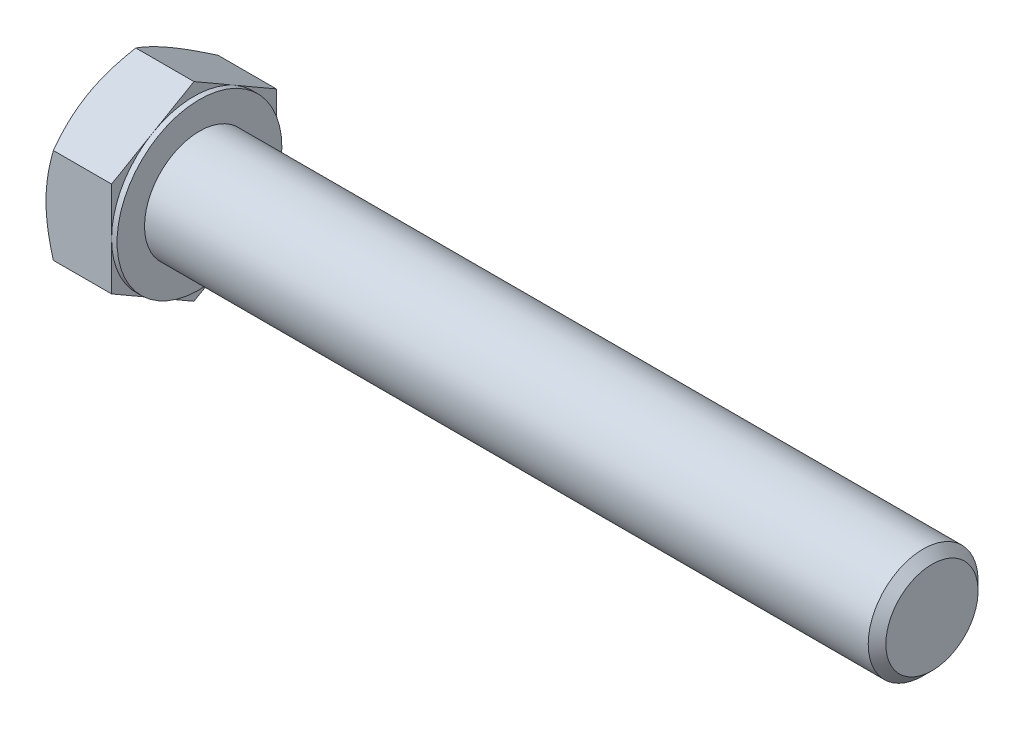
ISO-10303-21;
HEADER;
FILE_DESCRIPTION(('STEP AP214'),'2;1');
FILE_NAME('part.step','',(''),(''),'','','');
FILE_SCHEMA(('AUTOMOTIVE_DESIGN { 1 0 10303 214 1 1 1 1 }'));
ENDSEC;
DATA;
#1=APPLICATION_CONTEXT('core data for automotive mechanical design processes');
#2=APPLICATION_PROTOCOL_DEFINITION('international standard','automotive_design',2000,#1);
#3=PRODUCT_CONTEXT('',#1,'mechanical');
#4=PRODUCT('Part','Part','',(#3));
#5=PRODUCT_RELATED_PRODUCT_CATEGORY('part','',(#4));
#6=PRODUCT_DEFINITION_FORMATION('','',#4);
#7=PRODUCT_DEFINITION_CONTEXT('part definition',#1,'design');
#8=PRODUCT_DEFINITION('design','',#6,#7);
#9=PRODUCT_DEFINITION_SHAPE('','',#8);
#10=(LENGTH_UNIT() NAMED_UNIT(*) SI_UNIT(.MILLI.,.METRE.));
#11=(NAMED_UNIT(*) PLANE_ANGLE_UNIT() SI_UNIT($,.RADIAN.));
#12=(NAMED_UNIT(*) SI_UNIT($,.STERADIAN.) SOLID_ANGLE_UNIT());
#13=UNCERTAINTY_MEASURE_WITH_UNIT(LENGTH_MEASURE(1.E-05),#10,'distance_accuracy_value','');
#14=(GEOMETRIC_REPRESENTATION_CONTEXT(3) GLOBAL_UNCERTAINTY_ASSIGNED_CONTEXT((#13)) GLOBAL_UNIT_ASSIGNED_CONTEXT((#10,
#11,#12)) REPRESENTATION_CONTEXT('',''));
#15=CARTESIAN_POINT('',(0.,0.,0.));
#16=DIRECTION('',(0.,0.,1.));
#17=DIRECTION('',(1.,0.,0.));
#18=AXIS2_PLACEMENT_3D('',#15,#16,#17);
#19=CARTESIAN_POINT('',(7.76,5.19615242270663,-9.));
#20=DIRECTION('',(0.,-0.866025403784438,0.500000000000001));
#21=DIRECTION('',(0.,-0.500000000000001,-0.866025403784438));
#22=AXIS2_PLACEMENT_3D('',#19,#20,#21);
#23=PLANE('',#22);
#24=DIRECTION('',(0.,0.500000000000001,0.866025403784438));
#25=VECTOR('',#24,1.);
#26=CARTESIAN_POINT('',(7.16,5.19615242270663,-9.));
#27=LINE('',#26,#25);
#28=CARTESIAN_POINT('',(7.16,5.19615242270663,-9.));
#29=VERTEX_POINT('',#28);
#30=CARTESIAN_POINT('',(7.16,7.79422863405994,-4.50000000000001));
#31=VERTEX_POINT('',#30);
#32=EDGE_CURVE('E164',#29,#31,#27,.T.);
#33=ORIENTED_EDGE('',*,*,#32,.F.);
#34=DIRECTION('',(-1.,0.,0.));
#35=VECTOR('',#34,1.);
#36=CARTESIAN_POINT('',(7.76,5.19615242270663,-9.));
#37=LINE('',#36,#35);
#38=CARTESIAN_POINT('',(0.803847577293355,5.19615242270663,-9.));
#39=VERTEX_POINT('',#38);
#40=EDGE_CURVE('E291',#29,#39,#37,.T.);
#41=ORIENTED_EDGE('',*,*,#40,.T.);
#42=CARTESIAN_POINT('',(0.803914245071126,10.3924203154671,0.000199999999999971));
#43=CARTESIAN_POINT('',(0.737982001874049,10.2782163639798,-0.197607046401217));
#44=CARTESIAN_POINT('',(0.675041409210307,10.1635669787649,-0.396185606649945));
#45=CARTESIAN_POINT('',(0.555968997655532,9.93333715083391,-0.794955366044209));
#46=CARTESIAN_POINT('',(0.499840117752058,9.81775632901308,-0.99514722181845));
#47=CARTESIAN_POINT('',(0.395151960728959,9.58544915100228,-1.3975150570961));
#48=CARTESIAN_POINT('',(0.346610772912783,9.46872074181186,-1.59969459250059));
#49=CARTESIAN_POINT('',(0.258148516787919,9.23447001335913,-2.00542875589074));
#50=CARTESIAN_POINT('',(0.218225687483272,9.11694786135374,-2.20898309417891));
#51=CARTESIAN_POINT('',(0.148684674147113,8.88408932604662,-2.61230590830691));
#52=CARTESIAN_POINT('',(0.118837502847799,8.76877014301847,-2.812044592399));
#53=CARTESIAN_POINT('',(0.0687933098590815,8.53761579013205,-3.21241567598899));
#54=CARTESIAN_POINT('',(0.0485954355375402,8.42178066677662,-3.4130479949416));
#55=CARTESIAN_POINT('',(0.0183543473973477,8.18990950036671,-3.81466063597381));
#56=CARTESIAN_POINT('',(0.00829960958430331,8.07387383570154,-4.01564030266393));
#57=CARTESIAN_POINT('',(-0.00143766485491801,7.84169571742974,-4.41778459991642));
#58=CARTESIAN_POINT('',(-0.00112052193524407,7.72555326723328,-4.61894922457222));
#59=CARTESIAN_POINT('',(0.00916395215317265,7.50842142195782,-4.9950326125305));
#60=CARTESIAN_POINT('',(0.0178767400303962,7.40741671639994,-5.16997789436028));
#61=CARTESIAN_POINT('',(0.0429773400653687,7.20564389241818,-5.51945867708334));
#62=CARTESIAN_POINT('',(0.0593656695806682,7.10487579040239,-5.69399414955697));
#63=CARTESIAN_POINT('',(0.119656556235828,6.8029615939808,-6.2169248772855));
#64=CARTESIAN_POINT('',(0.174677482341126,6.60234990505054,-6.56439451510491));
#65=CARTESIAN_POINT('',(0.312230476325146,6.1989985076226,-7.263019628754));
#66=CARTESIAN_POINT('',(0.395345618627102,5.99631027619253,-7.61408594368717));
#67=CARTESIAN_POINT('',(0.583982539436455,5.59395639760763,-8.3109833040186));
#68=CARTESIAN_POINT('',(0.689460012893349,5.39428559809852,-8.65682327355628));
#69=CARTESIAN_POINT('',(0.803914245071122,5.19603695265279,-9.0002));
#70=B_SPLINE_CURVE_WITH_KNOTS('',3,(#42,#43,#44,#45,#46,#47,#48,#49,#50,#51,#52,#53,#54,#55,#56,
#57,#58,#59,#60,#61,#62,#63,#64,#65,#66,#67,#68,#69),.UNSPECIFIED.,.F.,.F.,(4,2,2,2,2,2,2,2,2,2,
2,2,2,4),(0.,0.713219249102577,1.42674513853509,2.14194697262263,2.8570025303448,
3.55449749123034,4.25193080859214,4.94857085059645,5.64518936892662,6.25162976378283,
6.8581110406634,8.07193747617894,9.31268391793542,10.5509947443908),.UNSPECIFIED.);
#71=CARTESIAN_POINT('',(0.,7.79422863405994,-4.5));
#72=VERTEX_POINT('',#71);
#73=EDGE_CURVE('E215',#72,#39,#70,.T.);
#74=ORIENTED_EDGE('',*,*,#73,.F.);
#75=CARTESIAN_POINT('',(0.80384757729336,10.3923048454133,0.));
#76=VERTEX_POINT('',#75);
#77=EDGE_CURVE('E55',#76,#72,#70,.T.);
#78=ORIENTED_EDGE('',*,*,#77,.F.);
#79=DIRECTION('',(-1.,0.,0.));
#80=VECTOR('',#79,1.);
#81=CARTESIAN_POINT('',(7.76,10.3923048454133,0.));
#82=LINE('',#81,#80);
#83=CARTESIAN_POINT('',(7.16,10.3923048454133,0.));
#84=VERTEX_POINT('',#83);
#85=EDGE_CURVE('E241',#84,#76,#82,.T.);
#86=ORIENTED_EDGE('',*,*,#85,.F.);
#87=EDGE_CURVE('E162',#31,#84,#27,.T.);
#88=ORIENTED_EDGE('',*,*,#87,.F.);
#89=EDGE_LOOP('',(#33,#41,#74,#78,#86,#88));
#90=FACE_BOUND('',#89,.T.);
#91=ADVANCED_FACE('F32',(#90),#23,.F.);
#92=CARTESIAN_POINT('',(7.76,10.3923048454133,0.));
#93=DIRECTION('',(0.,-0.866025403784438,-0.500000000000001));
#94=DIRECTION('',(0.,0.500000000000001,-0.866025403784438));
#95=AXIS2_PLACEMENT_3D('',#92,#93,#94);
#96=PLANE('',#95);
#97=DIRECTION('',(0.,-0.500000000000001,0.866025403784438));
#98=VECTOR('',#97,1.);
#99=CARTESIAN_POINT('',(7.16,10.3923048454133,0.));
#100=LINE('',#99,#98);
#101=CARTESIAN_POINT('',(7.16,7.79422863405994,4.50000000000001));
#102=VERTEX_POINT('',#101);
#103=EDGE_CURVE('E161',#84,#102,#100,.T.);
#104=ORIENTED_EDGE('',*,*,#103,.F.);
#105=ORIENTED_EDGE('',*,*,#85,.T.);
#106=CARTESIAN_POINT('',(0.803914245071121,5.19603695265279,9.0002));
#107=CARTESIAN_POINT('',(0.737982001874044,5.31024090414014,8.80239295359878));
#108=CARTESIAN_POINT('',(0.675041409210303,5.42489028935503,8.60381439335005));
#109=CARTESIAN_POINT('',(0.555968997655528,5.65512011728599,8.20504463395579));
#110=CARTESIAN_POINT('',(0.499840117752055,5.77070093910682,8.00485277818155));
#111=CARTESIAN_POINT('',(0.395151960728956,6.00300811711761,7.6024849429039));
#112=CARTESIAN_POINT('',(0.34661077291278,6.11973652630803,7.40030540749941));
#113=CARTESIAN_POINT('',(0.258148516787915,6.35398725476076,6.99457124410926));
#114=CARTESIAN_POINT('',(0.21822568748327,6.47150940676615,6.79101690582109));
#115=CARTESIAN_POINT('',(0.148684674147112,6.70436794207327,6.38769409169309));
#116=CARTESIAN_POINT('',(0.118837502847797,6.81968712510142,6.187955407601));
#117=CARTESIAN_POINT('',(0.0687933098590805,7.05084147798785,5.78758432401101));
#118=CARTESIAN_POINT('',(0.0485954355375393,7.16667660134327,5.5869520050584));
#119=CARTESIAN_POINT('',(0.0183543473973471,7.39854776775318,5.18533936402619));
#120=CARTESIAN_POINT('',(0.008299609584303,7.51458343241836,4.98435969733607));
#121=CARTESIAN_POINT('',(-0.0014376648549182,7.74676155069016,4.58221540008358));
#122=CARTESIAN_POINT('',(-0.0011205219352444,7.86290400088661,4.38105077542779));
#123=CARTESIAN_POINT('',(0.00916395215317247,8.08003584616207,4.00496738746951));
#124=CARTESIAN_POINT('',(0.0178767400303963,8.18104055171995,3.83002210563972));
#125=CARTESIAN_POINT('',(0.0429773400653692,8.38281337570171,3.48054132291666));
#126=CARTESIAN_POINT('',(0.0593656695806689,8.4835814777175,3.30600585044304));
#127=CARTESIAN_POINT('',(0.119656556235829,8.7854956741391,2.7830751227145));
#128=CARTESIAN_POINT('',(0.174677482341127,8.98610736306936,2.43560548489509));
#129=CARTESIAN_POINT('',(0.312230476325149,9.38945876049729,1.736980371246));
#130=CARTESIAN_POINT('',(0.395345618627105,9.59214699192737,1.38591405631283));
#131=CARTESIAN_POINT('',(0.583982539436459,9.99450087051226,0.689016695981396));
#132=CARTESIAN_POINT('',(0.689460012893353,10.1941716700214,0.343176726443722));
#133=CARTESIAN_POINT('',(0.803914245071126,10.3924203154671,-0.000200000000000151));
#134=B_SPLINE_CURVE_WITH_KNOTS('',3,(#106,#107,#108,#109,#110,#111,#112,#113,#114,#115,#116,
#117,#118,#119,#120,#121,#122,#123,#124,#125,#126,#127,#128,#129,#130,#131,#132,#133),
.UNSPECIFIED.,.F.,.F.,(4,2,2,2,2,2,2,2,2,2,2,2,2,4),(0.,0.713219249102574,1.42674513853508,
2.14194697262262,2.8570025303448,3.55449749123033,4.25193080859214,4.94857085059644,
5.64518936892661,6.25162976378283,6.85811104066339,8.07193747617893,9.31268391793541,
10.5509947443908),.UNSPECIFIED.);
#135=CARTESIAN_POINT('',(0.,7.79422863405994,4.50000000000001));
#136=VERTEX_POINT('',#135);
#137=EDGE_CURVE('E212',#136,#76,#134,.T.);
#138=ORIENTED_EDGE('',*,*,#137,.F.);
#139=CARTESIAN_POINT('',(0.803847577293355,5.19615242270663,9.));
#140=VERTEX_POINT('',#139);
#141=EDGE_CURVE('E223',#140,#136,#134,.T.);
#142=ORIENTED_EDGE('',*,*,#141,.F.);
#143=DIRECTION('',(-1.,0.,0.));
#144=VECTOR('',#143,1.);
#145=CARTESIAN_POINT('',(7.76,5.19615242270663,9.));
#146=LINE('',#145,#144);
#147=CARTESIAN_POINT('',(7.16,5.19615242270663,9.));
#148=VERTEX_POINT('',#147);
#149=EDGE_CURVE('E247',#148,#140,#146,.T.);
#150=ORIENTED_EDGE('',*,*,#149,.F.);
#151=EDGE_CURVE('E129',#102,#148,#100,.T.);
#152=ORIENTED_EDGE('',*,*,#151,.F.);
#153=EDGE_LOOP('',(#104,#105,#138,#142,#150,#152));
#154=FACE_BOUND('',#153,.T.);
#155=ADVANCED_FACE('F229',(#154),#96,.F.);
#156=CARTESIAN_POINT('',(7.76,5.19615242270663,9.));
#157=DIRECTION('',(0.,0.,-1.));
#158=DIRECTION('',(0.,1.,0.));
#159=AXIS2_PLACEMENT_3D('',#156,#157,#158);
#160=PLANE('',#159);
#161=DIRECTION('',(0.,-1.,0.));
#162=VECTOR('',#161,1.);
#163=CARTESIAN_POINT('',(7.16,5.19615242270663,9.));
#164=LINE('',#163,#162);
#165=CARTESIAN_POINT('',(7.16,0.,9.));
#166=VERTEX_POINT('',#165);
#167=EDGE_CURVE('E123',#148,#166,#164,.T.);
#168=ORIENTED_EDGE('',*,*,#167,.F.);
#169=ORIENTED_EDGE('',*,*,#149,.T.);
#170=CARTESIAN_POINT('',(4.50308345606073,-14.1853984750485,9.));
#171=CARTESIAN_POINT('',(4.3105443091319,-13.7903499619441,9.));
#172=CARTESIAN_POINT('',(4.11978648036002,-13.3944187289972,9.));
#173=CARTESIAN_POINT('',(3.74283091028608,-12.6003222353684,9.));
#174=CARTESIAN_POINT('',(3.55663384534684,-12.2021566539649,9.));
#175=CARTESIAN_POINT('',(3.1889085669211,-11.4011784042428,9.));
#176=CARTESIAN_POINT('',(3.00740939394884,-10.998352359037,9.));
#177=CARTESIAN_POINT('',(2.65153988968442,-10.1895752731495,9.));
#178=CARTESIAN_POINT('',(2.47716923625493,-9.78362437466715,9.));
#179=CARTESIAN_POINT('',(2.13161245153416,-8.95398189745988,9.));
#180=CARTESIAN_POINT('',(1.96074001614281,-8.53015895835006,9.));
#181=CARTESIAN_POINT('',(1.63138410189173,-7.67764040846507,9.));
#182=CARTESIAN_POINT('',(1.47290198123408,-7.24894426938238,9.));
#183=CARTESIAN_POINT('',(1.17232155247292,-6.38672363466421,9.));
#184=CARTESIAN_POINT('',(1.03019194566189,-5.95321016502651,9.));
#185=CARTESIAN_POINT('',(0.766724668982638,-5.07998336306545,9.));
#186=CARTESIAN_POINT('',(0.645380685897052,-4.64027195731316,9.));
#187=CARTESIAN_POINT('',(0.429822600187391,-3.75682505840833,9.));
#188=CARTESIAN_POINT('',(0.33545258645297,-3.31312863839347,9.));
#189=CARTESIAN_POINT('',(0.218090109862411,-2.64336713224847,9.));
#190=CARTESIAN_POINT('',(0.182999861987044,-2.41939560592136,9.));
#191=CARTESIAN_POINT('',(0.121565667139729,-1.97026354213496,9.));
#192=CARTESIAN_POINT('',(0.0952208698915734,-1.74510312242952,9.));
#193=CARTESIAN_POINT('',(0.0521451470049074,-1.296934806137,9.));
#194=CARTESIAN_POINT('',(0.0352889796574916,-1.07393899899181,9.));
#195=CARTESIAN_POINT('',(0.0110310637867477,-0.627433597199454,9.));
#196=CARTESIAN_POINT('',(0.00362915198480068,-0.403924011492227,9.));
#197=CARTESIAN_POINT('',(-0.00154262378413869,0.0432079406441165,9.));
#198=CARTESIAN_POINT('',(0.000687480723096673,0.266830306701706,9.));
#199=CARTESIAN_POINT('',(0.0147226079643605,0.713776878191385,9.));
#200=CARTESIAN_POINT('',(0.0265280662822145,0.937101069596552,9.));
#201=CARTESIAN_POINT('',(0.0656502904232114,1.46707212508444,9.));
#202=CARTESIAN_POINT('',(0.0971347684278855,1.77341845684229,9.));
#203=CARTESIAN_POINT('',(0.176454334209294,2.3839702866691,9.));
#204=CARTESIAN_POINT('',(0.224291458828897,2.68817551322792,9.));
#205=CARTESIAN_POINT('',(0.389806404498596,3.59715813833384,9.));
#206=CARTESIAN_POINT('',(0.529461898664756,4.19799413397008,9.));
#207=CARTESIAN_POINT('',(0.773331874087609,5.09670707135548,9.));
#208=CARTESIAN_POINT('',(0.861532433522253,5.39919911344218,9.));
#209=CARTESIAN_POINT('',(1.04752099468879,6.00125026931421,9.));
#210=CARTESIAN_POINT('',(1.14530906486315,6.3008093621453,9.));
#211=CARTESIAN_POINT('',(1.34886866345679,6.89708059643017,9.));
#212=CARTESIAN_POINT('',(1.45463788009348,7.19379353443474,9.));
#213=CARTESIAN_POINT('',(1.67287302313915,7.78473288300155,9.));
#214=CARTESIAN_POINT('',(1.78533883831153,8.07895933477393,9.));
#215=CARTESIAN_POINT('',(2.07523735650256,8.81619445838363,9.));
#216=CARTESIAN_POINT('',(2.25629467397397,9.25777585340514,9.));
#217=CARTESIAN_POINT('',(2.62827522661662,10.136777660382,9.));
#218=CARTESIAN_POINT('',(2.81919929109126,10.574197718905,9.));
#219=CARTESIAN_POINT('',(3.20877963784733,11.445728658812,9.));
#220=CARTESIAN_POINT('',(3.40743823524847,11.8798385021484,9.));
#221=CARTESIAN_POINT('',(3.81079737629817,12.745217955896,9.));
#222=CARTESIAN_POINT('',(4.01549773929348,13.176487650759,9.));
#223=CARTESIAN_POINT('',(4.43000777933054,14.0372827230625,9.));
#224=CARTESIAN_POINT('',(4.63982402654444,14.4668049304787,9.));
#225=CARTESIAN_POINT('',(5.06336871777016,15.3239162782486,9.));
#226=CARTESIAN_POINT('',(5.27709718538546,15.7515054069202,9.));
#227=CARTESIAN_POINT('',(5.70771290050865,16.6049951511437,9.));
#228=CARTESIAN_POINT('',(5.9245995931952,17.030896046943,9.));
#229=CARTESIAN_POINT('',(6.36101693702055,17.8813418325908,9.));
#230=CARTESIAN_POINT('',(6.58054759918209,18.3058867167768,9.));
#231=CARTESIAN_POINT('',(7.20096689804883,19.4981240202845,9.));
#232=CARTESIAN_POINT('',(7.60436223876302,20.2645118461521,8.99999999999999));
#233=CARTESIAN_POINT('',(8.41646748159567,21.794506601112,8.99999999999999));
#234=CARTESIAN_POINT('',(8.82517763678689,22.558113395549,8.99999999999999));
#235=CARTESIAN_POINT('',(9.64538992580595,24.0808854326839,8.99999999999999));
#236=CARTESIAN_POINT('',(10.0568800853251,24.8400571295378,8.99999999999999));
#237=CARTESIAN_POINT('',(10.6764233722192,25.977523198369,8.99999999999999));
#238=CARTESIAN_POINT('',(10.883315594978,26.3564507974704,8.99999999999999));
#239=CARTESIAN_POINT('',(11.2977907149854,27.113927384209,8.99999999999999));
#240=CARTESIAN_POINT('',(11.505373611221,27.4924763724005,8.99999999999999));
#241=CARTESIAN_POINT('',(11.713260584997,27.8708583433541,8.99999999999999));
#242=B_SPLINE_CURVE_WITH_KNOTS('',3,(#170,#171,#172,#173,#174,#175,#176,#177,#178,#179,#180,
#181,#182,#183,#184,#185,#186,#187,#188,#189,#190,#191,#192,#193,#194,#195,#196,#197,#198,#199,
#200,#201,#202,#203,#204,#205,#206,#207,#208,#209,#210,#211,#212,#213,#214,#215,#216,#217,#218,
#219,#220,#221,#222,#223,#224,#225,#226,#227,#228,#229,#230,#231,#232,#233,#234,#235,#236,#237,
#238,#239,#240,#241),.UNSPECIFIED.,.F.,.F.,(4,2,2,2,2,2,2,2,2,2,2,2,2,2,2,2,2,2,2,2,2,2,2,2,2,2,
2,2,2,2,2,2,2,2,2,4),(0.,1.3184276523281,2.63704965842302,3.96247407975987,5.28783853889641,
6.65860359348417,8.02951869858867,9.39776461460016,10.7655942135616,12.1253499558398,
12.8053173295708,13.4852185741162,14.1559216158064,14.8266130740413,15.497302337092,
16.1680221115772,17.0913849258576,18.0148627937263,19.8627426236502,20.8079230607688,
21.7531102457472,22.6980246953435,23.6429234534266,25.0745302518136,26.506257573556,
27.9384167887983,29.3705332247167,30.804597376367,32.2386701829632,33.6724940274115,
35.1063238515574,37.7045032698604,40.3028068606692,42.8933552338532,44.1885437504927,
45.4837303681959),.UNSPECIFIED.);
#243=CARTESIAN_POINT('',(0.,0.,9.));
#244=VERTEX_POINT('',#243);
#245=EDGE_CURVE('E224',#244,#140,#242,.T.);
#246=ORIENTED_EDGE('',*,*,#245,.F.);
#247=CARTESIAN_POINT('',(0.803847577293357,-5.19615242270663,9.));
#248=VERTEX_POINT('',#247);
#249=EDGE_CURVE('E300',#248,#244,#242,.T.);
#250=ORIENTED_EDGE('',*,*,#249,.F.);
#251=DIRECTION('',(-1.,0.,0.));
#252=VECTOR('',#251,1.);
#253=CARTESIAN_POINT('',(7.76,-5.19615242270663,9.));
#254=LINE('',#253,#252);
#255=CARTESIAN_POINT('',(7.16,-5.19615242270663,9.));
#256=VERTEX_POINT('',#255);
#257=EDGE_CURVE('E155',#256,#248,#254,.T.);
#258=ORIENTED_EDGE('',*,*,#257,.F.);
#259=EDGE_CURVE('E133',#166,#256,#164,.T.);
#260=ORIENTED_EDGE('',*,*,#259,.F.);
#261=EDGE_LOOP('',(#168,#169,#246,#250,#258,#260));
#262=FACE_BOUND('',#261,.T.);
#263=ADVANCED_FACE('F153',(#262),#160,.F.);
#264=CARTESIAN_POINT('',(7.76,-10.3923048454133,0.));
#265=DIRECTION('',(0.,0.866025403784438,-0.500000000000001));
#266=DIRECTION('',(0.,0.500000000000001,0.866025403784438));
#267=AXIS2_PLACEMENT_3D('',#264,#265,#266);
#268=PLANE('',#267);
#269=DIRECTION('',(0.,-0.500000000000001,-0.866025403784438));
#270=VECTOR('',#269,1.);
#271=CARTESIAN_POINT('',(7.16,-10.3923048454133,0.));
#272=LINE('',#271,#270);
#273=CARTESIAN_POINT('',(7.16,-7.79422863405994,4.50000000000001));
#274=VERTEX_POINT('',#273);
#275=EDGE_CURVE('E140',#256,#274,#272,.T.);
#276=ORIENTED_EDGE('',*,*,#275,.F.);
#277=ORIENTED_EDGE('',*,*,#257,.T.);
#278=CARTESIAN_POINT('',(0.80391424507113,-10.3924203154671,-0.000200000000000234));
#279=CARTESIAN_POINT('',(0.737982001874053,-10.2782163639798,0.197607046401216));
#280=CARTESIAN_POINT('',(0.675041409210311,-10.1635669787649,0.396185606649944));
#281=CARTESIAN_POINT('',(0.555968997655536,-9.93333715083391,0.794955366044209));
#282=CARTESIAN_POINT('',(0.499840117752062,-9.81775632901308,0.99514722181845));
#283=CARTESIAN_POINT('',(0.395151960728963,-9.58544915100229,1.3975150570961));
#284=CARTESIAN_POINT('',(0.346610772912787,-9.46872074181187,1.59969459250059));
#285=CARTESIAN_POINT('',(0.258148516787922,-9.23447001335914,2.00542875589074));
#286=CARTESIAN_POINT('',(0.218225687483276,-9.11694786135375,2.20898309417891));
#287=CARTESIAN_POINT('',(0.148684674147117,-8.88408932604663,2.61230590830691));
#288=CARTESIAN_POINT('',(0.118837502847803,-8.76877014301848,2.812044592399));
#289=CARTESIAN_POINT('',(0.0687933098590855,-8.53761579013205,3.21241567598899));
#290=CARTESIAN_POINT('',(0.0485954355375433,-8.42178066677662,3.4130479949416));
#291=CARTESIAN_POINT('',(0.0183543473973501,-8.18990950036672,3.81466063597381));
#292=CARTESIAN_POINT('',(0.0082996095843061,-8.07387383570154,4.01564030266393));
#293=CARTESIAN_POINT('',(-0.00143766485491529,-7.84169571742974,4.41778459991642));
#294=CARTESIAN_POINT('',(-0.00112052193524179,-7.72555326723329,4.61894922457222));
#295=CARTESIAN_POINT('',(0.0091639521531744,-7.50842142195783,4.9950326125305));
#296=CARTESIAN_POINT('',(0.0178767400303978,-7.40741671639994,5.16997789436029));
#297=CARTESIAN_POINT('',(0.0429773400653704,-7.20564389241818,5.51945867708334));
#298=CARTESIAN_POINT('',(0.0593656695806701,-7.1048757904024,5.69399414955697));
#299=CARTESIAN_POINT('',(0.11965655623583,-6.8029615939808,6.2169248772855));
#300=CARTESIAN_POINT('',(0.174677482341128,-6.60234990505054,6.56439451510491));
#301=CARTESIAN_POINT('',(0.312230476325148,-6.19899850762261,7.263019628754));
#302=CARTESIAN_POINT('',(0.395345618627103,-5.99631027619253,7.61408594368717));
#303=CARTESIAN_POINT('',(0.583982539436455,-5.59395639760764,8.3109833040186));
#304=CARTESIAN_POINT('',(0.689460012893349,-5.39428559809853,8.65682327355628));
#305=CARTESIAN_POINT('',(0.803914245071123,-5.19603695265279,9.0002));
#306=B_SPLINE_CURVE_WITH_KNOTS('',3,(#278,#279,#280,#281,#282,#283,#284,#285,#286,#287,#288,
#289,#290,#291,#292,#293,#294,#295,#296,#297,#298,#299,#300,#301,#302,#303,#304,#305),
.UNSPECIFIED.,.F.,.F.,(4,2,2,2,2,2,2,2,2,2,2,2,2,4),(0.,0.713219249102577,1.42674513853509,
2.14194697262263,2.8570025303448,3.55449749123034,4.25193080859215,4.94857085059645,
5.64518936892662,6.25162976378284,6.8581110406634,8.07193747617894,9.31268391793542,
10.5509947443908),.UNSPECIFIED.);
#307=CARTESIAN_POINT('',(0.,-7.79422863405994,4.50000000000001));
#308=VERTEX_POINT('',#307);
#309=EDGE_CURVE('E214',#308,#248,#306,.T.);
#310=ORIENTED_EDGE('',*,*,#309,.F.);
#311=CARTESIAN_POINT('',(0.803847577293365,-10.3923048454133,0.));
#312=VERTEX_POINT('',#311);
#313=EDGE_CURVE('E207',#312,#308,#306,.T.);
#314=ORIENTED_EDGE('',*,*,#313,.F.);
#315=DIRECTION('',(-1.,0.,0.));
#316=VECTOR('',#315,1.);
#317=CARTESIAN_POINT('',(7.76,-10.3923048454133,0.));
#318=LINE('',#317,#316);
#319=CARTESIAN_POINT('',(7.16,-10.3923048454133,0.));
#320=VERTEX_POINT('',#319);
#321=EDGE_CURVE('E285',#320,#312,#318,.T.);
#322=ORIENTED_EDGE('',*,*,#321,.F.);
#323=EDGE_CURVE('E156',#274,#320,#272,.T.);
#324=ORIENTED_EDGE('',*,*,#323,.F.);
#325=EDGE_LOOP('',(#276,#277,#310,#314,#322,#324));
#326=FACE_BOUND('',#325,.T.);
#327=ADVANCED_FACE('F199',(#326),#268,.F.);
#328=CARTESIAN_POINT('',(7.76,-5.19615242270664,-9.));
#329=DIRECTION('',(0.,0.866025403784438,0.5));
#330=DIRECTION('',(0.,-0.5,0.866025403784439));
#331=AXIS2_PLACEMENT_3D('',#328,#329,#330);
#332=PLANE('',#331);
#333=DIRECTION('',(0.,0.5,-0.866025403784439));
#334=VECTOR('',#333,1.);
#335=CARTESIAN_POINT('',(7.16,-5.19615242270664,-9.));
#336=LINE('',#335,#334);
#337=CARTESIAN_POINT('',(7.16,-7.79422863405995,-4.5));
#338=VERTEX_POINT('',#337);
#339=EDGE_CURVE('E504',#320,#338,#336,.T.);
#340=ORIENTED_EDGE('',*,*,#339,.F.);
#341=ORIENTED_EDGE('',*,*,#321,.T.);
#342=CARTESIAN_POINT('',(0.803914245071126,-5.1960369526528,-9.0002));
#343=CARTESIAN_POINT('',(0.737982001874048,-5.31024090414015,-8.80239295359879));
#344=CARTESIAN_POINT('',(0.675041409210307,-5.42489028935504,-8.60381439335006));
#345=CARTESIAN_POINT('',(0.555968997655533,-5.655120117286,-8.20504463395579));
#346=CARTESIAN_POINT('',(0.49984011775206,-5.77070093910683,-8.00485277818155));
#347=CARTESIAN_POINT('',(0.395151960728962,-6.00300811711763,-7.60248494290391));
#348=CARTESIAN_POINT('',(0.346610772912786,-6.11973652630805,-7.40030540749941));
#349=CARTESIAN_POINT('',(0.258148516787921,-6.35398725476078,-6.99457124410926));
#350=CARTESIAN_POINT('',(0.218225687483275,-6.47150940676617,-6.79101690582109));
#351=CARTESIAN_POINT('',(0.148684674147117,-6.70436794207329,-6.38769409169309));
#352=CARTESIAN_POINT('',(0.118837502847803,-6.81968712510144,-6.187955407601));
#353=CARTESIAN_POINT('',(0.068793309859086,-7.05084147798786,-5.78758432401101));
#354=CARTESIAN_POINT('',(0.0485954355375439,-7.16667660134329,-5.5869520050584));
#355=CARTESIAN_POINT('',(0.0183543473973518,-7.39854776775319,-5.18533936402619));
#356=CARTESIAN_POINT('',(0.00829960958430857,-7.51458343241837,-4.98435969733607));
#357=CARTESIAN_POINT('',(-0.00143766485491176,-7.74676155069017,-4.58221540008358));
#358=CARTESIAN_POINT('',(-0.00112052193523797,-7.86290400088663,-4.38105077542778));
#359=CARTESIAN_POINT('',(0.00916395215317905,-8.08003584616209,-4.0049673874695));
#360=CARTESIAN_POINT('',(0.017876740030403,-8.18104055171997,-3.83002210563971));
#361=CARTESIAN_POINT('',(0.0429773400653758,-8.38281337570173,-3.48054132291666));
#362=CARTESIAN_POINT('',(0.0593656695806753,-8.48358147771751,-3.30600585044303));
#363=CARTESIAN_POINT('',(0.119656556235836,-8.78549567413911,-2.7830751227145));
#364=CARTESIAN_POINT('',(0.174677482341135,-8.98610736306937,-2.43560548489509));
#365=CARTESIAN_POINT('',(0.312230476325156,-9.3894587604973,-1.736980371246));
#366=CARTESIAN_POINT('',(0.395345618627111,-9.59214699192738,-1.38591405631283));
#367=CARTESIAN_POINT('',(0.583982539436462,-9.99450087051227,-0.689016695981395));
#368=CARTESIAN_POINT('',(0.689460012893356,-10.1941716700214,-0.343176726443722));
#369=CARTESIAN_POINT('',(0.80391424507113,-10.3924203154671,0.00019999999999899));
#370=B_SPLINE_CURVE_WITH_KNOTS('',3,(#342,#343,#344,#345,#346,#347,#348,#349,#350,#351,#352,
#353,#354,#355,#356,#357,#358,#359,#360,#361,#362,#363,#364,#365,#366,#367,#368,#369),
.UNSPECIFIED.,.F.,.F.,(4,2,2,2,2,2,2,2,2,2,2,2,2,4),(0.,0.713219249102576,1.42674513853509,
2.14194697262263,2.8570025303448,3.55449749123034,4.25193080859215,4.94857085059645,
5.64518936892662,6.25162976378283,6.8581110406634,8.07193747617894,9.31268391793542,
10.5509947443908),.UNSPECIFIED.);
#371=CARTESIAN_POINT('',(0.,-7.79422863405994,-4.5));
#372=VERTEX_POINT('',#371);
#373=EDGE_CURVE('E213',#372,#312,#370,.T.);
#374=ORIENTED_EDGE('',*,*,#373,.F.);
#375=CARTESIAN_POINT('',(0.803847577293105,-5.19615242270703,-9.));
#376=VERTEX_POINT('',#375);
#377=EDGE_CURVE('E177',#376,#372,#370,.T.);
#378=ORIENTED_EDGE('',*,*,#377,.F.);
#379=DIRECTION('',(-1.,0.,0.));
#380=VECTOR('',#379,1.);
#381=CARTESIAN_POINT('',(7.76,-5.19615242270664,-9.));
#382=LINE('',#381,#380);
#383=CARTESIAN_POINT('',(7.16,-5.19615242270664,-9.));
#384=VERTEX_POINT('',#383);
#385=EDGE_CURVE('E292',#384,#376,#382,.T.);
#386=ORIENTED_EDGE('',*,*,#385,.F.);
#387=EDGE_CURVE('E151',#338,#384,#336,.T.);
#388=ORIENTED_EDGE('',*,*,#387,.F.);
#389=EDGE_LOOP('',(#340,#341,#374,#378,#386,#388));
#390=FACE_BOUND('',#389,.T.);
#391=ADVANCED_FACE('F192',(#390),#332,.F.);
#392=CARTESIAN_POINT('',(7.76,5.19615242270663,-9.));
#393=DIRECTION('',(0.,0.,1.));
#394=DIRECTION('',(0.,-1.,0.));
#395=AXIS2_PLACEMENT_3D('',#392,#393,#394);
#396=PLANE('',#395);
#397=DIRECTION('',(0.,1.,0.));
#398=VECTOR('',#397,1.);
#399=CARTESIAN_POINT('',(7.16,5.19615242270663,-9.));
#400=LINE('',#399,#398);
#401=CARTESIAN_POINT('',(7.16,0.,-9.));
#402=VERTEX_POINT('',#401);
#403=EDGE_CURVE('E11',#384,#402,#400,.T.);
#404=ORIENTED_EDGE('',*,*,#403,.F.);
#405=ORIENTED_EDGE('',*,*,#385,.T.);
#406=CARTESIAN_POINT('',(4.50308345606073,-14.1853984750485,-9.));
#407=CARTESIAN_POINT('',(4.31054430913191,-13.7903499619441,-9.));
#408=CARTESIAN_POINT('',(4.11978648036003,-13.3944187289972,-9.));
#409=CARTESIAN_POINT('',(3.74283091028608,-12.6003222353684,-9.));
#410=CARTESIAN_POINT('',(3.55663384534685,-12.2021566539649,-9.));
#411=CARTESIAN_POINT('',(3.1889085669211,-11.4011784042428,-9.));
#412=CARTESIAN_POINT('',(3.00740939394885,-10.998352359037,-9.));
#413=CARTESIAN_POINT('',(2.65153988968443,-10.1895752731496,-9.));
#414=CARTESIAN_POINT('',(2.47716923625493,-9.78362437466716,-9.));
#415=CARTESIAN_POINT('',(2.13161245153416,-8.9539818974599,-9.));
#416=CARTESIAN_POINT('',(1.96074001614282,-8.53015895835007,-9.));
#417=CARTESIAN_POINT('',(1.63138410189174,-7.67764040846509,-9.));
#418=CARTESIAN_POINT('',(1.47290198123408,-7.2489442693824,-9.));
#419=CARTESIAN_POINT('',(1.17232155247292,-6.38672363466422,-9.));
#420=CARTESIAN_POINT('',(1.0301919456619,-5.95321016502652,-9.));
#421=CARTESIAN_POINT('',(0.766724668982641,-5.07998336306546,-9.));
#422=CARTESIAN_POINT('',(0.645380685897056,-4.64027195731317,-9.));
#423=CARTESIAN_POINT('',(0.429822600187396,-3.75682505840834,-9.));
#424=CARTESIAN_POINT('',(0.335452586452973,-3.31312863839348,-9.));
#425=CARTESIAN_POINT('',(0.218090109862414,-2.64336713224848,-9.));
#426=CARTESIAN_POINT('',(0.182999861987046,-2.41939560592136,-9.));
#427=CARTESIAN_POINT('',(0.121565667139731,-1.97026354213497,-9.));
#428=CARTESIAN_POINT('',(0.0952208698915748,-1.74510312242953,-9.));
#429=CARTESIAN_POINT('',(0.0521451470049081,-1.29693480613701,-9.));
#430=CARTESIAN_POINT('',(0.0352889796574915,-1.07393899899182,-9.));
#431=CARTESIAN_POINT('',(0.0110310637867477,-0.627433597199461,-9.));
#432=CARTESIAN_POINT('',(0.00362915198480162,-0.403924011492234,-9.));
#433=CARTESIAN_POINT('',(-0.00154262378413762,0.0432079406441094,-9.));
#434=CARTESIAN_POINT('',(0.000687480723096996,0.266830306701698,-9.));
#435=CARTESIAN_POINT('',(0.0147226079643602,0.713776878191377,-9.));
#436=CARTESIAN_POINT('',(0.0265280662822144,0.937101069596544,-9.));
#437=CARTESIAN_POINT('',(0.0656502904232115,1.46707212508443,-9.));
#438=CARTESIAN_POINT('',(0.0971347684278857,1.77341845684228,-9.));
#439=CARTESIAN_POINT('',(0.176454334209294,2.3839702866691,-9.));
#440=CARTESIAN_POINT('',(0.224291458828896,2.68817551322792,-9.));
#441=CARTESIAN_POINT('',(0.389806404498594,3.59715813833383,-9.));
#442=CARTESIAN_POINT('',(0.529461898664753,4.19799413397007,-9.));
#443=CARTESIAN_POINT('',(0.773331874087607,5.09670707135548,-9.));
#444=CARTESIAN_POINT('',(0.861532433522251,5.39919911344217,-9.));
#445=CARTESIAN_POINT('',(1.04752099468879,6.0012502693142,-9.));
#446=CARTESIAN_POINT('',(1.14530906486314,6.30080936214529,-9.));
#447=CARTESIAN_POINT('',(1.34886866345678,6.89708059643016,-9.));
#448=CARTESIAN_POINT('',(1.45463788009347,7.19379353443473,-9.));
#449=CARTESIAN_POINT('',(1.67287302313915,7.78473288300153,-9.));
#450=CARTESIAN_POINT('',(1.78533883831153,8.07895933477392,-9.));
#451=CARTESIAN_POINT('',(2.07523735650255,8.81619445838362,-9.));
#452=CARTESIAN_POINT('',(2.25629467397397,9.25777585340513,-9.));
#453=CARTESIAN_POINT('',(2.62827522661661,10.136777660382,-9.));
#454=CARTESIAN_POINT('',(2.81919929109125,10.5741977189049,-9.));
#455=CARTESIAN_POINT('',(3.20877963784732,11.445728658812,-9.));
#456=CARTESIAN_POINT('',(3.40743823524846,11.8798385021484,-9.));
#457=CARTESIAN_POINT('',(3.81079737629817,12.745217955896,-9.));
#458=CARTESIAN_POINT('',(4.01549773929348,13.176487650759,-9.));
#459=CARTESIAN_POINT('',(4.43000777933054,14.0372827230624,-9.));
#460=CARTESIAN_POINT('',(4.63982402654444,14.4668049304787,-9.));
#461=CARTESIAN_POINT('',(5.06336871777016,15.3239162782486,-9.));
#462=CARTESIAN_POINT('',(5.27709718538546,15.7515054069202,-9.));
#463=CARTESIAN_POINT('',(5.70771290050865,16.6049951511437,-9.));
#464=CARTESIAN_POINT('',(5.9245995931952,17.0308960469429,-9.));
#465=CARTESIAN_POINT('',(6.36101693702055,17.8813418325908,-9.));
#466=CARTESIAN_POINT('',(6.58054759918209,18.3058867167768,-9.));
#467=CARTESIAN_POINT('',(7.20096689804883,19.4981240202845,-9.));
#468=CARTESIAN_POINT('',(7.60436223876302,20.2645118461521,-9.));
#469=CARTESIAN_POINT('',(8.41646748159567,21.794506601112,-9.));
#470=CARTESIAN_POINT('',(8.82517763678689,22.558113395549,-9.));
#471=CARTESIAN_POINT('',(9.64538992580596,24.0808854326839,-9.));
#472=CARTESIAN_POINT('',(10.0568800853251,24.8400571295378,-9.));
#473=CARTESIAN_POINT('',(10.6764233722192,25.977523198369,-9.));
#474=CARTESIAN_POINT('',(10.883315594978,26.3564507974704,-9.));
#475=CARTESIAN_POINT('',(11.2977907149854,27.113927384209,-9.));
#476=CARTESIAN_POINT('',(11.505373611221,27.4924763724005,-9.));
#477=CARTESIAN_POINT('',(11.713260584997,27.8708583433541,-9.));
#478=B_SPLINE_CURVE_WITH_KNOTS('',3,(#406,#407,#408,#409,#410,#411,#412,#413,#414,#415,#416,
#417,#418,#419,#420,#421,#422,#423,#424,#425,#426,#427,#428,#429,#430,#431,#432,#433,#434,#435,
#436,#437,#438,#439,#440,#441,#442,#443,#444,#445,#446,#447,#448,#449,#450,#451,#452,#453,#454,
#455,#456,#457,#458,#459,#460,#461,#462,#463,#464,#465,#466,#467,#468,#469,#470,#471,#472,#473,
#474,#475,#476,#477),.UNSPECIFIED.,.F.,.F.,(4,2,2,2,2,2,2,2,2,2,2,2,2,2,2,2,2,2,2,2,2,2,2,2,2,2,
2,2,2,2,2,2,2,2,2,4),(0.,1.3184276523281,2.63704965842302,3.96247407975987,5.28783853889641,
6.65860359348416,8.02951869858867,9.39776461460016,10.7655942135616,12.1253499558398,
12.8053173295708,13.4852185741162,14.1559216158064,14.8266130740413,15.497302337092,
16.1680221115772,17.0913849258576,18.0148627937263,19.8627426236502,20.8079230607688,
21.7531102457472,22.6980246953435,23.6429234534266,25.0745302518136,26.506257573556,
27.9384167887983,29.3705332247167,30.804597376367,32.2386701829632,33.6724940274115,
35.1063238515574,37.7045032698604,40.3028068606692,42.8933552338532,44.1885437504927,
45.4837303681959),.UNSPECIFIED.);
#479=CARTESIAN_POINT('',(0.,0.,-9.));
#480=VERTEX_POINT('',#479);
#481=EDGE_CURVE('E168',#480,#376,#478,.F.);
#482=ORIENTED_EDGE('',*,*,#481,.F.);
#483=EDGE_CURVE('E176',#39,#480,#478,.F.);
#484=ORIENTED_EDGE('',*,*,#483,.F.);
#485=ORIENTED_EDGE('',*,*,#40,.F.);
#486=EDGE_CURVE('E36',#402,#29,#400,.T.);
#487=ORIENTED_EDGE('',*,*,#486,.F.);
#488=EDGE_LOOP('',(#404,#405,#482,#484,#485,#487));
#489=FACE_BOUND('',#488,.T.);
#490=ADVANCED_FACE('F187',(#489),#396,.F.);
#491=CARTESIAN_POINT('',(0.,0.,0.));
#492=DIRECTION('',(1.,0.,0.));
#493=DIRECTION('',(0.,0.,-1.));
#494=AXIS2_PLACEMENT_3D('',#491,#492,#493);
#495=CONICAL_SURFACE('',#494,9.,1.0471975511966);
#496=ORIENTED_EDGE('',*,*,#377,.T.);
#497=CARTESIAN_POINT('',(0.,0.,0.));
#498=DIRECTION('',(1.,0.,0.));
#499=DIRECTION('',(0.,0.,-1.));
#500=AXIS2_PLACEMENT_3D('',#497,#498,#499);
#501=CIRCLE('',#500,9.);
#502=EDGE_CURVE('E246',#372,#480,#501,.T.);
#503=ORIENTED_EDGE('',*,*,#502,.T.);
#504=ORIENTED_EDGE('',*,*,#481,.T.);
#505=EDGE_LOOP('',(#496,#503,#504));
#506=FACE_BOUND('',#505,.T.);
#507=ADVANCED_FACE('F191',(#506),#495,.T.);
#508=ORIENTED_EDGE('',*,*,#313,.T.);
#509=EDGE_CURVE('E250',#308,#372,#501,.T.);
#510=ORIENTED_EDGE('',*,*,#509,.T.);
#511=ORIENTED_EDGE('',*,*,#373,.T.);
#512=EDGE_LOOP('',(#508,#510,#511));
#513=FACE_BOUND('',#512,.T.);
#514=ADVANCED_FACE('F273',(#513),#495,.T.);
#515=ORIENTED_EDGE('',*,*,#249,.T.);
#516=EDGE_CURVE('E264',#244,#308,#501,.T.);
#517=ORIENTED_EDGE('',*,*,#516,.T.);
#518=ORIENTED_EDGE('',*,*,#309,.T.);
#519=EDGE_LOOP('',(#515,#517,#518));
#520=FACE_BOUND('',#519,.T.);
#521=ADVANCED_FACE('F183',(#520),#495,.T.);
#522=ORIENTED_EDGE('',*,*,#245,.T.);
#523=ORIENTED_EDGE('',*,*,#141,.T.);
#524=CARTESIAN_POINT('',(0.,0.,0.));
#525=DIRECTION('',(-1.,0.,0.));
#526=DIRECTION('',(0.,0.,1.));
#527=AXIS2_PLACEMENT_3D('',#524,#525,#526);
#528=CIRCLE('',#527,9.);
#529=EDGE_CURVE('E165',#244,#136,#528,.T.);
#530=ORIENTED_EDGE('',*,*,#529,.F.);
#531=EDGE_LOOP('',(#522,#523,#530));
#532=FACE_BOUND('',#531,.T.);
#533=ADVANCED_FACE('F310',(#532),#495,.T.);
#534=ORIENTED_EDGE('',*,*,#137,.T.);
#535=ORIENTED_EDGE('',*,*,#77,.T.);
#536=EDGE_CURVE('E259',#72,#136,#501,.T.);
#537=ORIENTED_EDGE('',*,*,#536,.T.);
#538=EDGE_LOOP('',(#534,#535,#537));
#539=FACE_BOUND('',#538,.T.);
#540=ADVANCED_FACE('F311',(#539),#495,.T.);
#541=ORIENTED_EDGE('',*,*,#73,.T.);
#542=ORIENTED_EDGE('',*,*,#483,.T.);
#543=EDGE_CURVE('E252',#480,#72,#501,.T.);
#544=ORIENTED_EDGE('',*,*,#543,.T.);
#545=EDGE_LOOP('',(#541,#542,#544));
#546=FACE_BOUND('',#545,.T.);
#547=ADVANCED_FACE('F287',(#546),#495,.T.);
#548=CARTESIAN_POINT('',(0.97,0.192376607408562,0.0332122445882987));
#549=DIRECTION('',(-1.,0.,0.));
#550=DIRECTION('',(0.,0.,1.));
#551=AXIS2_PLACEMENT_3D('',#548,#549,#550);
#552=PLANE('',#551);
#553=CARTESIAN_POINT('',(0.97,0.192376607408562,0.0332122445882987));
#554=DIRECTION('',(-1.,0.,0.));
#555=DIRECTION('',(0.,0.,1.));
#556=AXIS2_PLACEMENT_3D('',#553,#554,#555);
#557=CIRCLE('',#556,7.875);
#558=CARTESIAN_POINT('',(0.97,0.192376607408562,7.9082122445883));
#559=VERTEX_POINT('',#558);
#560=EDGE_CURVE('E306',#559,#559,#557,.T.);
#561=ORIENTED_EDGE('',*,*,#560,.T.);
#562=EDGE_LOOP('',(#561));
#563=FACE_BOUND('',#562,.T.);
#564=ADVANCED_FACE('F317',(#563),#552,.T.);
#565=CARTESIAN_POINT('',(0.97,0.192376607408562,0.0332122445882987));
#566=DIRECTION('',(-1.,0.,0.));
#567=DIRECTION('',(0.,0.,1.));
#568=AXIS2_PLACEMENT_3D('',#565,#566,#567);
#569=CYLINDRICAL_SURFACE('',#568,7.875);
#570=ORIENTED_EDGE('',*,*,#560,.F.);
#571=EDGE_LOOP('',(#570));
#572=FACE_BOUND('',#571,.T.);
#573=CARTESIAN_POINT('',(0.,0.192376607408562,0.0332122445882987));
#574=DIRECTION('',(-1.,0.,0.));
#575=DIRECTION('',(0.,0.,1.));
#576=AXIS2_PLACEMENT_3D('',#573,#574,#575);
#577=CIRCLE('',#576,7.875);
#578=CARTESIAN_POINT('',(0.,0.192376607408562,7.9082122445883));
#579=VERTEX_POINT('',#578);
#580=EDGE_CURVE('E304',#579,#579,#577,.T.);
#581=ORIENTED_EDGE('',*,*,#580,.T.);
#582=EDGE_LOOP('',(#581));
#583=FACE_BOUND('',#582,.T.);
#584=ADVANCED_FACE('F364',(#572,#583),#569,.F.);
#585=CARTESIAN_POINT('',(0.,10.3923048454133,0.));
#586=DIRECTION('',(1.,0.,0.));
#587=DIRECTION('',(0.,0.,-1.));
#588=AXIS2_PLACEMENT_3D('',#585,#586,#587);
#589=PLANE('',#588);
#590=ORIENTED_EDGE('',*,*,#580,.F.);
#591=EDGE_LOOP('',(#590));
#592=FACE_BOUND('',#591,.T.);
#593=ORIENTED_EDGE('',*,*,#543,.F.);
#594=ORIENTED_EDGE('',*,*,#502,.F.);
#595=ORIENTED_EDGE('',*,*,#509,.F.);
#596=ORIENTED_EDGE('',*,*,#516,.F.);
#597=ORIENTED_EDGE('',*,*,#529,.T.);
#598=ORIENTED_EDGE('',*,*,#536,.F.);
#599=EDGE_LOOP('',(#593,#594,#595,#596,#597,#598));
#600=FACE_BOUND('',#599,.T.);
#601=ADVANCED_FACE('F194',(#592,#600),#589,.F.);
#602=CARTESIAN_POINT('',(7.16,9.,0.));
#603=DIRECTION('',(1.,0.,0.));
#604=DIRECTION('',(0.,0.,-1.));
#605=AXIS2_PLACEMENT_3D('',#602,#603,#604);
#606=PLANE('',#605);
#607=ORIENTED_EDGE('',*,*,#32,.T.);
#608=CARTESIAN_POINT('',(7.16,0.,0.));
#609=DIRECTION('',(-1.,0.,0.));
#610=DIRECTION('',(0.,0.,1.));
#611=AXIS2_PLACEMENT_3D('',#608,#609,#610);
#612=CIRCLE('',#611,9.);
#613=EDGE_CURVE('E47',#31,#402,#612,.T.);
#614=ORIENTED_EDGE('',*,*,#613,.T.);
#615=ORIENTED_EDGE('',*,*,#486,.T.);
#616=EDGE_LOOP('',(#607,#614,#615));
#617=FACE_BOUND('',#616,.T.);
#618=ADVANCED_FACE('F363',(#617),#606,.T.);
#619=ORIENTED_EDGE('',*,*,#87,.T.);
#620=ORIENTED_EDGE('',*,*,#103,.T.);
#621=EDGE_CURVE('E150',#102,#31,#612,.T.);
#622=ORIENTED_EDGE('',*,*,#621,.T.);
#623=EDGE_LOOP('',(#619,#620,#622));
#624=FACE_BOUND('',#623,.T.);
#625=ADVANCED_FACE('F488',(#624),#606,.T.);
#626=ORIENTED_EDGE('',*,*,#151,.T.);
#627=ORIENTED_EDGE('',*,*,#167,.T.);
#628=EDGE_CURVE('E127',#166,#102,#612,.T.);
#629=ORIENTED_EDGE('',*,*,#628,.T.);
#630=EDGE_LOOP('',(#626,#627,#629));
#631=FACE_BOUND('',#630,.T.);
#632=ADVANCED_FACE('F125',(#631),#606,.T.);
#633=ORIENTED_EDGE('',*,*,#259,.T.);
#634=ORIENTED_EDGE('',*,*,#275,.T.);
#635=EDGE_CURVE('E137',#274,#166,#612,.T.);
#636=ORIENTED_EDGE('',*,*,#635,.T.);
#637=EDGE_LOOP('',(#633,#634,#636));
#638=FACE_BOUND('',#637,.T.);
#639=ADVANCED_FACE('F138',(#638),#606,.T.);
#640=ORIENTED_EDGE('',*,*,#323,.T.);
#641=ORIENTED_EDGE('',*,*,#339,.T.);
#642=EDGE_CURVE('E144',#338,#274,#612,.T.);
#643=ORIENTED_EDGE('',*,*,#642,.T.);
#644=EDGE_LOOP('',(#640,#641,#643));
#645=FACE_BOUND('',#644,.T.);
#646=ADVANCED_FACE('F464',(#645),#606,.T.);
#647=ORIENTED_EDGE('',*,*,#387,.T.);
#648=ORIENTED_EDGE('',*,*,#403,.T.);
#649=EDGE_CURVE('E503',#402,#338,#612,.T.);
#650=ORIENTED_EDGE('',*,*,#649,.T.);
#651=EDGE_LOOP('',(#647,#648,#650));
#652=FACE_BOUND('',#651,.T.);
#653=ADVANCED_FACE('F455',(#652),#606,.T.);
#654=CARTESIAN_POINT('',(0.,0.,0.));
#655=DIRECTION('',(-1.,0.,0.));
#656=DIRECTION('',(0.,0.,1.));
#657=AXIS2_PLACEMENT_3D('',#654,#655,#656);
#658=CYLINDRICAL_SURFACE('',#657,9.);
#659=ORIENTED_EDGE('',*,*,#613,.F.);
#660=ORIENTED_EDGE('',*,*,#621,.F.);
#661=ORIENTED_EDGE('',*,*,#628,.F.);
#662=ORIENTED_EDGE('',*,*,#635,.F.);
#663=ORIENTED_EDGE('',*,*,#642,.F.);
#664=ORIENTED_EDGE('',*,*,#649,.F.);
#665=EDGE_LOOP('',(#659,#660,#661,#662,#663,#664));
#666=FACE_BOUND('',#665,.T.);
#667=CARTESIAN_POINT('',(7.76,0.,0.));
#668=DIRECTION('',(1.,0.,0.));
#669=DIRECTION('',(0.,0.,-1.));
#670=AXIS2_PLACEMENT_3D('',#667,#668,#669);
#671=CIRCLE('',#670,9.);
#672=CARTESIAN_POINT('',(7.76,0.,-9.));
#673=VERTEX_POINT('',#672);
#674=EDGE_CURVE('E255',#673,#673,#671,.T.);
#675=ORIENTED_EDGE('',*,*,#674,.F.);
#676=EDGE_LOOP('',(#675));
#677=FACE_BOUND('',#676,.T.);
#678=ADVANCED_FACE('F147',(#666,#677),#658,.T.);
#679=CARTESIAN_POINT('',(87.76,0.,0.));
#680=DIRECTION('',(-1.,0.,0.));
#681=DIRECTION('',(0.,0.,1.));
#682=AXIS2_PLACEMENT_3D('',#679,#680,#681);
#683=PLANE('',#682);
#684=CARTESIAN_POINT('',(87.76,0.,0.));
#685=DIRECTION('',(-1.,0.,0.));
#686=DIRECTION('',(0.,0.,1.));
#687=AXIS2_PLACEMENT_3D('',#684,#685,#686);
#688=CIRCLE('',#687,5.036);
#689=CARTESIAN_POINT('',(87.76,0.,5.036));
#690=VERTEX_POINT('',#689);
#691=EDGE_CURVE('E515',#690,#690,#688,.T.);
#692=ORIENTED_EDGE('',*,*,#691,.F.);
#693=EDGE_LOOP('',(#692));
#694=FACE_BOUND('',#693,.T.);
#695=ADVANCED_FACE('F414',(#694),#683,.F.);
#696=CARTESIAN_POINT('',(87.76,0.,0.));
#697=DIRECTION('',(-1.,0.,0.));
#698=DIRECTION('',(0.,0.,1.));
#699=AXIS2_PLACEMENT_3D('',#696,#697,#698);
#700=CONICAL_SURFACE('',#699,5.036,0.785398163397452);
#701=CARTESIAN_POINT('',(86.796,0.,0.));
#702=DIRECTION('',(-1.,0.,0.));
#703=DIRECTION('',(0.,0.,1.));
#704=AXIS2_PLACEMENT_3D('',#701,#702,#703);
#705=CIRCLE('',#704,6.);
#706=CARTESIAN_POINT('',(86.796,0.,6.));
#707=VERTEX_POINT('',#706);
#708=EDGE_CURVE('E513',#707,#707,#705,.T.);
#709=ORIENTED_EDGE('',*,*,#708,.F.);
#710=EDGE_LOOP('',(#709));
#711=FACE_BOUND('',#710,.T.);
#712=ORIENTED_EDGE('',*,*,#691,.T.);
#713=EDGE_LOOP('',(#712));
#714=FACE_BOUND('',#713,.T.);
#715=ADVANCED_FACE('F418',(#711,#714),#700,.T.);
#716=CARTESIAN_POINT('',(0.,0.,0.));
#717=DIRECTION('',(-1.,0.,0.));
#718=DIRECTION('',(0.,0.,1.));
#719=AXIS2_PLACEMENT_3D('',#716,#717,#718);
#720=CYLINDRICAL_SURFACE('',#719,6.);
#721=CARTESIAN_POINT('',(7.76,0.,0.));
#722=DIRECTION('',(1.,0.,0.));
#723=DIRECTION('',(0.,0.,-1.));
#724=AXIS2_PLACEMENT_3D('',#721,#722,#723);
#725=CIRCLE('',#724,6.);
#726=CARTESIAN_POINT('',(7.76,0.,-6.));
#727=VERTEX_POINT('',#726);
#728=EDGE_CURVE('E296',#727,#727,#725,.F.);
#729=ORIENTED_EDGE('',*,*,#728,.F.);
#730=EDGE_LOOP('',(#729));
#731=FACE_BOUND('',#730,.T.);
#732=ORIENTED_EDGE('',*,*,#708,.T.);
#733=EDGE_LOOP('',(#732));
#734=FACE_BOUND('',#733,.T.);
#735=ADVANCED_FACE('F429',(#731,#734),#720,.T.);
#736=CARTESIAN_POINT('',(7.76,10.3923048454133,0.));
#737=DIRECTION('',(1.,0.,0.));
#738=DIRECTION('',(0.,0.,-1.));
#739=AXIS2_PLACEMENT_3D('',#736,#737,#738);
#740=PLANE('',#739);
#741=ORIENTED_EDGE('',*,*,#728,.T.);
#742=EDGE_LOOP('',(#741));
#743=FACE_BOUND('',#742,.T.);
#744=ORIENTED_EDGE('',*,*,#674,.T.);
#745=EDGE_LOOP('',(#744));
#746=FACE_BOUND('',#745,.T.);
#747=ADVANCED_FACE('F438',(#743,#746),#740,.T.);
#748=CLOSED_SHELL('',(#91,#155,#263,#327,#391,#490,#507,#514,#521,#533,#540,#547,#564,#584,#601,
#618,#625,#632,#639,#646,#653,#678,#695,#715,#735,#747));
#749=MANIFOLD_SOLID_BREP('B2',#748);
#750=ADVANCED_BREP_SHAPE_REPRESENTATION('',(#18,#749),#14);
#751=SHAPE_DEFINITION_REPRESENTATION(#9,#750);
ENDSEC;
END-ISO-10303-21;
